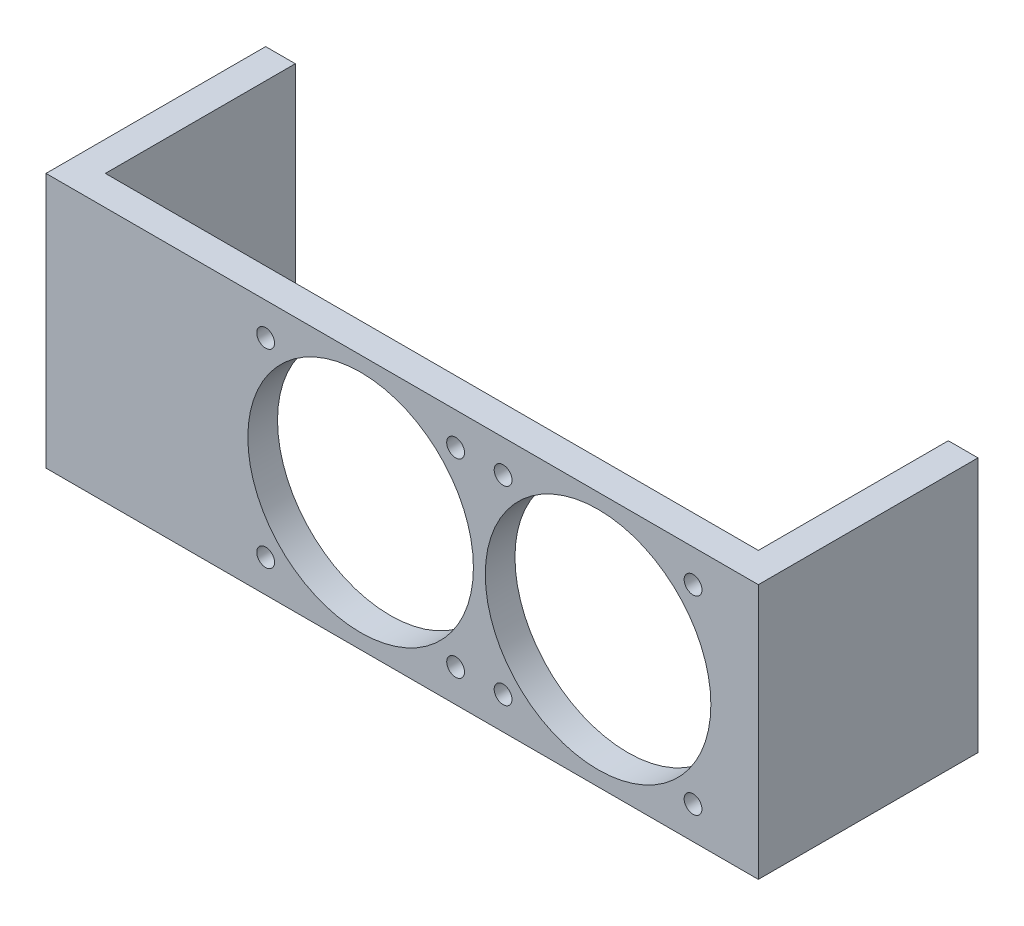
ISO-10303-21;
HEADER;
FILE_DESCRIPTION(('STEP AP214'),'2;1');
FILE_NAME('part.step','',(''),(''),'','','');
FILE_SCHEMA(('AUTOMOTIVE_DESIGN { 1 0 10303 214 1 1 1 1 }'));
ENDSEC;
DATA;
#1=APPLICATION_CONTEXT('core data for automotive mechanical design processes');
#2=APPLICATION_PROTOCOL_DEFINITION('international standard','automotive_design',2000,#1);
#3=PRODUCT_CONTEXT('',#1,'mechanical');
#4=PRODUCT('Part','Part','',(#3));
#5=PRODUCT_RELATED_PRODUCT_CATEGORY('part','',(#4));
#6=PRODUCT_DEFINITION_FORMATION('','',#4);
#7=PRODUCT_DEFINITION_CONTEXT('part definition',#1,'design');
#8=PRODUCT_DEFINITION('design','',#6,#7);
#9=PRODUCT_DEFINITION_SHAPE('','',#8);
#10=(LENGTH_UNIT() NAMED_UNIT(*) SI_UNIT(.MILLI.,.METRE.));
#11=(NAMED_UNIT(*) PLANE_ANGLE_UNIT() SI_UNIT($,.RADIAN.));
#12=(NAMED_UNIT(*) SI_UNIT($,.STERADIAN.) SOLID_ANGLE_UNIT());
#13=UNCERTAINTY_MEASURE_WITH_UNIT(LENGTH_MEASURE(1.E-05),#10,'distance_accuracy_value','');
#14=(GEOMETRIC_REPRESENTATION_CONTEXT(3) GLOBAL_UNCERTAINTY_ASSIGNED_CONTEXT((#13)) GLOBAL_UNIT_ASSIGNED_CONTEXT((#10,
#11,#12)) REPRESENTATION_CONTEXT('',''));
#15=CARTESIAN_POINT('',(0.,0.,0.));
#16=DIRECTION('',(0.,0.,1.));
#17=DIRECTION('',(1.,0.,0.));
#18=AXIS2_PLACEMENT_3D('',#15,#16,#17);
#19=CARTESIAN_POINT('',(0.,-17.2458628841607,5.));
#20=DIRECTION('',(0.,1.,0.));
#21=DIRECTION('',(0.,0.,1.));
#22=AXIS2_PLACEMENT_3D('',#19,#20,#21);
#23=PLANE('',#22);
#24=DIRECTION('',(1.,0.,0.));
#25=VECTOR('',#24,1.);
#26=CARTESIAN_POINT('',(0.,-17.2458628841607,0.));
#27=LINE('',#26,#25);
#28=CARTESIAN_POINT('',(-29.3853427895981,-17.2458628841608,0.));
#29=VERTEX_POINT('',#28);
#30=CARTESIAN_POINT('',(80.6146572104019,-17.2458628841607,0.));
#31=VERTEX_POINT('',#30);
#32=EDGE_CURVE('E196',#29,#31,#27,.T.);
#33=ORIENTED_EDGE('',*,*,#32,.T.);
#34=DIRECTION('',(0.,0.,1.));
#35=VECTOR('',#34,1.);
#36=CARTESIAN_POINT('',(80.6146572104019,-17.2458628841607,-32.));
#37=LINE('',#36,#35);
#38=CARTESIAN_POINT('',(80.6146572104019,-17.2458628841607,-32.));
#39=VERTEX_POINT('',#38);
#40=EDGE_CURVE('E60',#39,#31,#37,.T.);
#41=ORIENTED_EDGE('',*,*,#40,.F.);
#42=DIRECTION('',(1.,0.,0.));
#43=VECTOR('',#42,1.);
#44=CARTESIAN_POINT('',(80.6146572104019,-17.2458628841607,-32.));
#45=LINE('',#44,#43);
#46=CARTESIAN_POINT('',(85.6146572104019,-17.2458628841607,-32.));
#47=VERTEX_POINT('',#46);
#48=EDGE_CURVE('E143',#39,#47,#45,.T.);
#49=ORIENTED_EDGE('',*,*,#48,.T.);
#50=DIRECTION('',(0.,0.,1.));
#51=VECTOR('',#50,1.);
#52=CARTESIAN_POINT('',(85.6146572104019,-17.2458628841607,-32.));
#53=LINE('',#52,#51);
#54=CARTESIAN_POINT('',(85.6146572104019,-17.2458628841607,5.));
#55=VERTEX_POINT('',#54);
#56=EDGE_CURVE('E160',#47,#55,#53,.T.);
#57=ORIENTED_EDGE('',*,*,#56,.T.);
#58=DIRECTION('',(1.,0.,0.));
#59=VECTOR('',#58,1.);
#60=CARTESIAN_POINT('',(0.,-17.2458628841607,5.));
#61=LINE('',#60,#59);
#62=CARTESIAN_POINT('',(-34.3853427895981,-17.2458628841608,5.));
#63=VERTEX_POINT('',#62);
#64=EDGE_CURVE('E167',#63,#55,#61,.T.);
#65=ORIENTED_EDGE('',*,*,#64,.F.);
#66=DIRECTION('',(0.,0.,1.));
#67=VECTOR('',#66,1.);
#68=CARTESIAN_POINT('',(-34.3853427895981,-17.2458628841608,-32.));
#69=LINE('',#68,#67);
#70=CARTESIAN_POINT('',(-34.3853427895981,-17.2458628841608,-32.));
#71=VERTEX_POINT('',#70);
#72=EDGE_CURVE('E137',#71,#63,#69,.T.);
#73=ORIENTED_EDGE('',*,*,#72,.F.);
#74=DIRECTION('',(1.,0.,0.));
#75=VECTOR('',#74,1.);
#76=CARTESIAN_POINT('',(-29.3853427895981,-17.2458628841608,-32.));
#77=LINE('',#76,#75);
#78=CARTESIAN_POINT('',(-29.3853427895981,-17.2458628841608,-32.));
#79=VERTEX_POINT('',#78);
#80=EDGE_CURVE('E113',#71,#79,#77,.T.);
#81=ORIENTED_EDGE('',*,*,#80,.T.);
#82=DIRECTION('',(0.,0.,1.));
#83=VECTOR('',#82,1.);
#84=CARTESIAN_POINT('',(-29.3853427895981,-17.2458628841608,-32.));
#85=LINE('',#84,#83);
#86=EDGE_CURVE('E127',#79,#29,#85,.T.);
#87=ORIENTED_EDGE('',*,*,#86,.T.);
#88=EDGE_LOOP('',(#33,#41,#49,#57,#65,#73,#81,#87));
#89=FACE_BOUND('',#88,.T.);
#90=ADVANCED_FACE('F35',(#89),#23,.F.);
#91=CARTESIAN_POINT('',(0.,25.7541371158392,5.));
#92=DIRECTION('',(0.,1.,0.));
#93=DIRECTION('',(-1.,0.,0.));
#94=AXIS2_PLACEMENT_3D('',#91,#92,#93);
#95=PLANE('',#94);
#96=DIRECTION('',(1.,0.,0.));
#97=VECTOR('',#96,1.);
#98=CARTESIAN_POINT('',(0.,25.7541371158392,0.));
#99=LINE('',#98,#97);
#100=CARTESIAN_POINT('',(-29.3853427895981,25.7541371158392,0.));
#101=VERTEX_POINT('',#100);
#102=CARTESIAN_POINT('',(80.6146572104019,25.7541371158392,0.));
#103=VERTEX_POINT('',#102);
#104=EDGE_CURVE('E109',#101,#103,#99,.T.);
#105=ORIENTED_EDGE('',*,*,#104,.F.);
#106=DIRECTION('',(0.,0.,1.));
#107=VECTOR('',#106,1.);
#108=CARTESIAN_POINT('',(-29.3853427895981,25.7541371158392,-32.));
#109=LINE('',#108,#107);
#110=CARTESIAN_POINT('',(-29.3853427895981,25.7541371158392,-32.));
#111=VERTEX_POINT('',#110);
#112=EDGE_CURVE('E103',#111,#101,#109,.T.);
#113=ORIENTED_EDGE('',*,*,#112,.F.);
#114=DIRECTION('',(-1.,0.,0.));
#115=VECTOR('',#114,1.);
#116=CARTESIAN_POINT('',(-29.3853427895981,25.7541371158392,-32.));
#117=LINE('',#116,#115);
#118=CARTESIAN_POINT('',(-34.3853427895981,25.7541371158392,-32.));
#119=VERTEX_POINT('',#118);
#120=EDGE_CURVE('E107',#111,#119,#117,.T.);
#121=ORIENTED_EDGE('',*,*,#120,.T.);
#122=DIRECTION('',(0.,0.,1.));
#123=VECTOR('',#122,1.);
#124=CARTESIAN_POINT('',(-34.3853427895981,25.7541371158392,-32.));
#125=LINE('',#124,#123);
#126=CARTESIAN_POINT('',(-34.3853427895981,25.7541371158392,5.));
#127=VERTEX_POINT('',#126);
#128=EDGE_CURVE('E112',#119,#127,#125,.T.);
#129=ORIENTED_EDGE('',*,*,#128,.T.);
#130=DIRECTION('',(1.,0.,0.));
#131=VECTOR('',#130,1.);
#132=CARTESIAN_POINT('',(0.,25.7541371158392,5.));
#133=LINE('',#132,#131);
#134=CARTESIAN_POINT('',(85.6146572104019,25.7541371158393,5.));
#135=VERTEX_POINT('',#134);
#136=EDGE_CURVE('E169',#127,#135,#133,.T.);
#137=ORIENTED_EDGE('',*,*,#136,.T.);
#138=DIRECTION('',(0.,0.,1.));
#139=VECTOR('',#138,1.);
#140=CARTESIAN_POINT('',(85.6146572104019,25.7541371158393,-32.));
#141=LINE('',#140,#139);
#142=CARTESIAN_POINT('',(85.6146572104019,25.7541371158393,-32.));
#143=VERTEX_POINT('',#142);
#144=EDGE_CURVE('E157',#143,#135,#141,.T.);
#145=ORIENTED_EDGE('',*,*,#144,.F.);
#146=DIRECTION('',(-1.,0.,0.));
#147=VECTOR('',#146,1.);
#148=CARTESIAN_POINT('',(80.6146572104019,25.7541371158392,-32.));
#149=LINE('',#148,#147);
#150=CARTESIAN_POINT('',(80.6146572104019,25.7541371158392,-32.));
#151=VERTEX_POINT('',#150);
#152=EDGE_CURVE('E149',#143,#151,#149,.T.);
#153=ORIENTED_EDGE('',*,*,#152,.T.);
#154=DIRECTION('',(0.,0.,1.));
#155=VECTOR('',#154,1.);
#156=CARTESIAN_POINT('',(80.6146572104019,25.7541371158392,-32.));
#157=LINE('',#156,#155);
#158=EDGE_CURVE('E154',#151,#103,#157,.T.);
#159=ORIENTED_EDGE('',*,*,#158,.T.);
#160=EDGE_LOOP('',(#105,#113,#121,#129,#137,#145,#153,#159));
#161=FACE_BOUND('',#160,.T.);
#162=ADVANCED_FACE('F105',(#161),#95,.T.);
#163=CARTESIAN_POINT('',(74.6146572104018,20.2541371158392,5.));
#164=DIRECTION('',(0.,0.,-1.));
#165=DIRECTION('',(-1.,0.,0.));
#166=AXIS2_PLACEMENT_3D('',#163,#164,#165);
#167=CYLINDRICAL_SURFACE('',#166,1.5);
#168=CARTESIAN_POINT('',(74.6146572104018,20.2541371158392,5.));
#169=DIRECTION('',(0.,0.,1.));
#170=DIRECTION('',(1.,0.,0.));
#171=AXIS2_PLACEMENT_3D('',#168,#169,#170);
#172=CIRCLE('',#171,1.5);
#173=CARTESIAN_POINT('',(76.1146572104018,20.2541371158392,5.));
#174=VERTEX_POINT('',#173);
#175=EDGE_CURVE('E44',#174,#174,#172,.T.);
#176=ORIENTED_EDGE('',*,*,#175,.T.);
#177=EDGE_LOOP('',(#176));
#178=FACE_BOUND('',#177,.T.);
#179=CARTESIAN_POINT('',(74.6146572104018,20.2541371158392,0.));
#180=DIRECTION('',(0.,0.,1.));
#181=DIRECTION('',(1.,0.,0.));
#182=AXIS2_PLACEMENT_3D('',#179,#180,#181);
#183=CIRCLE('',#182,1.5);
#184=CARTESIAN_POINT('',(76.1146572104018,20.2541371158392,0.));
#185=VERTEX_POINT('',#184);
#186=EDGE_CURVE('E223',#185,#185,#183,.T.);
#187=ORIENTED_EDGE('',*,*,#186,.F.);
#188=EDGE_LOOP('',(#187));
#189=FACE_BOUND('',#188,.T.);
#190=ADVANCED_FACE('F253',(#178,#189),#167,.F.);
#191=CARTESIAN_POINT('',(42.6146572104019,-11.7458628841608,5.));
#192=DIRECTION('',(0.,0.,-1.));
#193=DIRECTION('',(-1.,0.,0.));
#194=AXIS2_PLACEMENT_3D('',#191,#192,#193);
#195=CYLINDRICAL_SURFACE('',#194,1.5);
#196=CARTESIAN_POINT('',(42.6146572104019,-11.7458628841608,5.));
#197=DIRECTION('',(0.,0.,1.));
#198=DIRECTION('',(1.,0.,0.));
#199=AXIS2_PLACEMENT_3D('',#196,#197,#198);
#200=CIRCLE('',#199,1.5);
#201=CARTESIAN_POINT('',(44.1146572104019,-11.7458628841608,5.));
#202=VERTEX_POINT('',#201);
#203=EDGE_CURVE('E189',#202,#202,#200,.F.);
#204=ORIENTED_EDGE('',*,*,#203,.F.);
#205=EDGE_LOOP('',(#204));
#206=FACE_BOUND('',#205,.T.);
#207=CARTESIAN_POINT('',(42.6146572104019,-11.7458628841608,0.));
#208=DIRECTION('',(0.,0.,1.));
#209=DIRECTION('',(1.,0.,0.));
#210=AXIS2_PLACEMENT_3D('',#207,#208,#209);
#211=CIRCLE('',#210,1.5);
#212=CARTESIAN_POINT('',(44.1146572104019,-11.7458628841608,0.));
#213=VERTEX_POINT('',#212);
#214=EDGE_CURVE('E221',#213,#213,#211,.F.);
#215=ORIENTED_EDGE('',*,*,#214,.T.);
#216=EDGE_LOOP('',(#215));
#217=FACE_BOUND('',#216,.T.);
#218=ADVANCED_FACE('F279',(#206,#217),#195,.F.);
#219=CARTESIAN_POINT('',(58.6146572104019,4.25413711583925,5.));
#220=DIRECTION('',(0.,0.,-1.));
#221=DIRECTION('',(-1.,0.,0.));
#222=AXIS2_PLACEMENT_3D('',#219,#220,#221);
#223=CYLINDRICAL_SURFACE('',#222,19.);
#224=CARTESIAN_POINT('',(58.6146572104019,4.25413711583925,5.));
#225=DIRECTION('',(0.,0.,1.));
#226=DIRECTION('',(1.,0.,0.));
#227=AXIS2_PLACEMENT_3D('',#224,#225,#226);
#228=CIRCLE('',#227,19.);
#229=CARTESIAN_POINT('',(77.6146572104019,4.25413711583925,5.));
#230=VERTEX_POINT('',#229);
#231=EDGE_CURVE('E186',#230,#230,#228,.T.);
#232=ORIENTED_EDGE('',*,*,#231,.T.);
#233=EDGE_LOOP('',(#232));
#234=FACE_BOUND('',#233,.T.);
#235=CARTESIAN_POINT('',(58.6146572104019,4.25413711583925,0.));
#236=DIRECTION('',(0.,0.,1.));
#237=DIRECTION('',(1.,0.,0.));
#238=AXIS2_PLACEMENT_3D('',#235,#236,#237);
#239=CIRCLE('',#238,19.);
#240=CARTESIAN_POINT('',(77.6146572104019,4.25413711583925,0.));
#241=VERTEX_POINT('',#240);
#242=EDGE_CURVE('E218',#241,#241,#239,.T.);
#243=ORIENTED_EDGE('',*,*,#242,.F.);
#244=EDGE_LOOP('',(#243));
#245=FACE_BOUND('',#244,.T.);
#246=ADVANCED_FACE('F275',(#234,#245),#223,.F.);
#247=CARTESIAN_POINT('',(74.6146572104019,-11.7458628841608,5.));
#248=DIRECTION('',(0.,0.,-1.));
#249=DIRECTION('',(-1.,0.,0.));
#250=AXIS2_PLACEMENT_3D('',#247,#248,#249);
#251=CYLINDRICAL_SURFACE('',#250,1.5);
#252=CARTESIAN_POINT('',(74.6146572104019,-11.7458628841608,5.));
#253=DIRECTION('',(0.,0.,1.));
#254=DIRECTION('',(1.,0.,0.));
#255=AXIS2_PLACEMENT_3D('',#252,#253,#254);
#256=CIRCLE('',#255,1.5);
#257=CARTESIAN_POINT('',(76.1146572104019,-11.7458628841608,5.));
#258=VERTEX_POINT('',#257);
#259=EDGE_CURVE('E183',#258,#258,#256,.T.);
#260=ORIENTED_EDGE('',*,*,#259,.T.);
#261=EDGE_LOOP('',(#260));
#262=FACE_BOUND('',#261,.T.);
#263=CARTESIAN_POINT('',(74.6146572104019,-11.7458628841608,0.));
#264=DIRECTION('',(0.,0.,1.));
#265=DIRECTION('',(1.,0.,0.));
#266=AXIS2_PLACEMENT_3D('',#263,#264,#265);
#267=CIRCLE('',#266,1.5);
#268=CARTESIAN_POINT('',(76.1146572104019,-11.7458628841608,0.));
#269=VERTEX_POINT('',#268);
#270=EDGE_CURVE('E215',#269,#269,#267,.T.);
#271=ORIENTED_EDGE('',*,*,#270,.F.);
#272=EDGE_LOOP('',(#271));
#273=FACE_BOUND('',#272,.T.);
#274=ADVANCED_FACE('F271',(#262,#273),#251,.F.);
#275=CARTESIAN_POINT('',(18.6146572104019,4.25413711583924,5.));
#276=DIRECTION('',(0.,0.,-1.));
#277=DIRECTION('',(-1.,0.,0.));
#278=AXIS2_PLACEMENT_3D('',#275,#276,#277);
#279=CYLINDRICAL_SURFACE('',#278,19.);
#280=CARTESIAN_POINT('',(18.6146572104019,4.25413711583924,5.));
#281=DIRECTION('',(0.,0.,1.));
#282=DIRECTION('',(1.,0.,0.));
#283=AXIS2_PLACEMENT_3D('',#280,#281,#282);
#284=CIRCLE('',#283,19.);
#285=CARTESIAN_POINT('',(37.6146572104019,4.25413711583924,5.));
#286=VERTEX_POINT('',#285);
#287=EDGE_CURVE('E180',#286,#286,#284,.F.);
#288=ORIENTED_EDGE('',*,*,#287,.F.);
#289=EDGE_LOOP('',(#288));
#290=FACE_BOUND('',#289,.T.);
#291=CARTESIAN_POINT('',(18.6146572104019,4.25413711583924,0.));
#292=DIRECTION('',(0.,0.,1.));
#293=DIRECTION('',(1.,0.,0.));
#294=AXIS2_PLACEMENT_3D('',#291,#292,#293);
#295=CIRCLE('',#294,19.);
#296=CARTESIAN_POINT('',(37.6146572104019,4.25413711583924,0.));
#297=VERTEX_POINT('',#296);
#298=EDGE_CURVE('E212',#297,#297,#295,.F.);
#299=ORIENTED_EDGE('',*,*,#298,.T.);
#300=EDGE_LOOP('',(#299));
#301=FACE_BOUND('',#300,.T.);
#302=ADVANCED_FACE('F267',(#290,#301),#279,.F.);
#303=CARTESIAN_POINT('',(34.6146572104019,20.2541371158392,5.));
#304=DIRECTION('',(0.,0.,-1.));
#305=DIRECTION('',(-1.,0.,0.));
#306=AXIS2_PLACEMENT_3D('',#303,#304,#305);
#307=CYLINDRICAL_SURFACE('',#306,1.5);
#308=CARTESIAN_POINT('',(34.6146572104019,20.2541371158392,5.));
#309=DIRECTION('',(0.,0.,1.));
#310=DIRECTION('',(1.,0.,0.));
#311=AXIS2_PLACEMENT_3D('',#308,#309,#310);
#312=CIRCLE('',#311,1.5);
#313=CARTESIAN_POINT('',(36.1146572104019,20.2541371158392,5.));
#314=VERTEX_POINT('',#313);
#315=EDGE_CURVE('E177',#314,#314,#312,.T.);
#316=ORIENTED_EDGE('',*,*,#315,.T.);
#317=EDGE_LOOP('',(#316));
#318=FACE_BOUND('',#317,.T.);
#319=CARTESIAN_POINT('',(34.6146572104019,20.2541371158392,0.));
#320=DIRECTION('',(0.,0.,1.));
#321=DIRECTION('',(1.,0.,0.));
#322=AXIS2_PLACEMENT_3D('',#319,#320,#321);
#323=CIRCLE('',#322,1.5);
#324=CARTESIAN_POINT('',(36.1146572104019,20.2541371158392,0.));
#325=VERTEX_POINT('',#324);
#326=EDGE_CURVE('E209',#325,#325,#323,.T.);
#327=ORIENTED_EDGE('',*,*,#326,.F.);
#328=EDGE_LOOP('',(#327));
#329=FACE_BOUND('',#328,.T.);
#330=ADVANCED_FACE('F263',(#318,#329),#307,.F.);
#331=CARTESIAN_POINT('',(2.61465721040187,-11.7458628841608,5.));
#332=DIRECTION('',(0.,0.,-1.));
#333=DIRECTION('',(-1.,0.,0.));
#334=AXIS2_PLACEMENT_3D('',#331,#332,#333);
#335=CYLINDRICAL_SURFACE('',#334,1.5);
#336=CARTESIAN_POINT('',(2.61465721040187,-11.7458628841608,5.));
#337=DIRECTION('',(0.,0.,1.));
#338=DIRECTION('',(1.,0.,0.));
#339=AXIS2_PLACEMENT_3D('',#336,#337,#338);
#340=CIRCLE('',#339,1.5);
#341=CARTESIAN_POINT('',(4.11465721040187,-11.7458628841608,5.));
#342=VERTEX_POINT('',#341);
#343=EDGE_CURVE('E174',#342,#342,#340,.F.);
#344=ORIENTED_EDGE('',*,*,#343,.F.);
#345=EDGE_LOOP('',(#344));
#346=FACE_BOUND('',#345,.T.);
#347=CARTESIAN_POINT('',(2.61465721040187,-11.7458628841608,0.));
#348=DIRECTION('',(0.,0.,1.));
#349=DIRECTION('',(1.,0.,0.));
#350=AXIS2_PLACEMENT_3D('',#347,#348,#349);
#351=CIRCLE('',#350,1.5);
#352=CARTESIAN_POINT('',(4.11465721040187,-11.7458628841608,0.));
#353=VERTEX_POINT('',#352);
#354=EDGE_CURVE('E206',#353,#353,#351,.F.);
#355=ORIENTED_EDGE('',*,*,#354,.T.);
#356=EDGE_LOOP('',(#355));
#357=FACE_BOUND('',#356,.T.);
#358=ADVANCED_FACE('F259',(#346,#357),#335,.F.);
#359=CARTESIAN_POINT('',(34.6146572104019,-11.7458628841608,5.));
#360=DIRECTION('',(0.,0.,-1.));
#361=DIRECTION('',(-1.,0.,0.));
#362=AXIS2_PLACEMENT_3D('',#359,#360,#361);
#363=CYLINDRICAL_SURFACE('',#362,1.5);
#364=CARTESIAN_POINT('',(34.6146572104019,-11.7458628841608,5.));
#365=DIRECTION('',(0.,0.,1.));
#366=DIRECTION('',(1.,0.,0.));
#367=AXIS2_PLACEMENT_3D('',#364,#365,#366);
#368=CIRCLE('',#367,1.5);
#369=CARTESIAN_POINT('',(36.1146572104019,-11.7458628841608,5.));
#370=VERTEX_POINT('',#369);
#371=EDGE_CURVE('E171',#370,#370,#368,.T.);
#372=ORIENTED_EDGE('',*,*,#371,.T.);
#373=EDGE_LOOP('',(#372));
#374=FACE_BOUND('',#373,.T.);
#375=CARTESIAN_POINT('',(34.6146572104019,-11.7458628841608,0.));
#376=DIRECTION('',(0.,0.,1.));
#377=DIRECTION('',(1.,0.,0.));
#378=AXIS2_PLACEMENT_3D('',#375,#376,#377);
#379=CIRCLE('',#378,1.5);
#380=CARTESIAN_POINT('',(36.1146572104019,-11.7458628841608,0.));
#381=VERTEX_POINT('',#380);
#382=EDGE_CURVE('E203',#381,#381,#379,.T.);
#383=ORIENTED_EDGE('',*,*,#382,.F.);
#384=EDGE_LOOP('',(#383));
#385=FACE_BOUND('',#384,.T.);
#386=ADVANCED_FACE('F256',(#374,#385),#363,.F.);
#387=CARTESIAN_POINT('',(2.61465721040187,20.2541371158392,5.));
#388=DIRECTION('',(0.,0.,-1.));
#389=DIRECTION('',(-1.,0.,0.));
#390=AXIS2_PLACEMENT_3D('',#387,#388,#389);
#391=CYLINDRICAL_SURFACE('',#390,1.5);
#392=CARTESIAN_POINT('',(2.61465721040187,20.2541371158392,5.));
#393=DIRECTION('',(0.,0.,1.));
#394=DIRECTION('',(1.,0.,0.));
#395=AXIS2_PLACEMENT_3D('',#392,#393,#394);
#396=CIRCLE('',#395,1.5);
#397=CARTESIAN_POINT('',(4.11465721040187,20.2541371158392,5.));
#398=VERTEX_POINT('',#397);
#399=EDGE_CURVE('E164',#398,#398,#396,.F.);
#400=ORIENTED_EDGE('',*,*,#399,.F.);
#401=EDGE_LOOP('',(#400));
#402=FACE_BOUND('',#401,.T.);
#403=CARTESIAN_POINT('',(2.61465721040187,20.2541371158392,0.));
#404=DIRECTION('',(0.,0.,1.));
#405=DIRECTION('',(1.,0.,0.));
#406=AXIS2_PLACEMENT_3D('',#403,#404,#405);
#407=CIRCLE('',#406,1.5);
#408=CARTESIAN_POINT('',(4.11465721040187,20.2541371158392,0.));
#409=VERTEX_POINT('',#408);
#410=EDGE_CURVE('E156',#409,#409,#407,.F.);
#411=ORIENTED_EDGE('',*,*,#410,.T.);
#412=EDGE_LOOP('',(#411));
#413=FACE_BOUND('',#412,.T.);
#414=ADVANCED_FACE('F37',(#402,#413),#391,.F.);
#415=CARTESIAN_POINT('',(42.6146572104019,20.2541371158392,5.));
#416=DIRECTION('',(0.,0.,-1.));
#417=DIRECTION('',(-1.,0.,0.));
#418=AXIS2_PLACEMENT_3D('',#415,#416,#417);
#419=CYLINDRICAL_SURFACE('',#418,1.5);
#420=CARTESIAN_POINT('',(42.6146572104019,20.2541371158392,5.));
#421=DIRECTION('',(0.,0.,1.));
#422=DIRECTION('',(1.,0.,0.));
#423=AXIS2_PLACEMENT_3D('',#420,#421,#422);
#424=CIRCLE('',#423,1.5);
#425=CARTESIAN_POINT('',(44.1146572104019,20.2541371158392,5.));
#426=VERTEX_POINT('',#425);
#427=EDGE_CURVE('E11',#426,#426,#424,.F.);
#428=ORIENTED_EDGE('',*,*,#427,.F.);
#429=EDGE_LOOP('',(#428));
#430=FACE_BOUND('',#429,.T.);
#431=CARTESIAN_POINT('',(42.6146572104019,20.2541371158392,0.));
#432=DIRECTION('',(0.,0.,1.));
#433=DIRECTION('',(1.,0.,0.));
#434=AXIS2_PLACEMENT_3D('',#431,#432,#433);
#435=CIRCLE('',#434,1.5);
#436=CARTESIAN_POINT('',(44.1146572104019,20.2541371158392,0.));
#437=VERTEX_POINT('',#436);
#438=EDGE_CURVE('E39',#437,#437,#435,.F.);
#439=ORIENTED_EDGE('',*,*,#438,.T.);
#440=EDGE_LOOP('',(#439));
#441=FACE_BOUND('',#440,.T.);
#442=ADVANCED_FACE('F230',(#430,#441),#419,.F.);
#443=CARTESIAN_POINT('',(0.,0.,5.));
#444=DIRECTION('',(0.,0.,1.));
#445=DIRECTION('',(1.,0.,0.));
#446=AXIS2_PLACEMENT_3D('',#443,#444,#445);
#447=PLANE('',#446);
#448=ORIENTED_EDGE('',*,*,#399,.T.);
#449=EDGE_LOOP('',(#448));
#450=FACE_BOUND('',#449,.T.);
#451=ORIENTED_EDGE('',*,*,#64,.T.);
#452=DIRECTION('',(0.,1.,0.));
#453=VECTOR('',#452,1.);
#454=CARTESIAN_POINT('',(85.6146572104019,25.7541371158393,5.));
#455=LINE('',#454,#453);
#456=EDGE_CURVE('E136',#55,#135,#455,.T.);
#457=ORIENTED_EDGE('',*,*,#456,.T.);
#458=ORIENTED_EDGE('',*,*,#136,.F.);
#459=DIRECTION('',(0.,-1.,0.));
#460=VECTOR('',#459,1.);
#461=CARTESIAN_POINT('',(-34.3853427895981,25.7541371158392,5.));
#462=LINE('',#461,#460);
#463=EDGE_CURVE('E128',#127,#63,#462,.T.);
#464=ORIENTED_EDGE('',*,*,#463,.T.);
#465=EDGE_LOOP('',(#451,#457,#458,#464));
#466=FACE_BOUND('',#465,.T.);
#467=ORIENTED_EDGE('',*,*,#371,.F.);
#468=EDGE_LOOP('',(#467));
#469=FACE_BOUND('',#468,.T.);
#470=ORIENTED_EDGE('',*,*,#343,.T.);
#471=EDGE_LOOP('',(#470));
#472=FACE_BOUND('',#471,.T.);
#473=ORIENTED_EDGE('',*,*,#315,.F.);
#474=EDGE_LOOP('',(#473));
#475=FACE_BOUND('',#474,.T.);
#476=ORIENTED_EDGE('',*,*,#287,.T.);
#477=EDGE_LOOP('',(#476));
#478=FACE_BOUND('',#477,.T.);
#479=ORIENTED_EDGE('',*,*,#259,.F.);
#480=EDGE_LOOP('',(#479));
#481=FACE_BOUND('',#480,.T.);
#482=ORIENTED_EDGE('',*,*,#231,.F.);
#483=EDGE_LOOP('',(#482));
#484=FACE_BOUND('',#483,.T.);
#485=ORIENTED_EDGE('',*,*,#203,.T.);
#486=EDGE_LOOP('',(#485));
#487=FACE_BOUND('',#486,.T.);
#488=ORIENTED_EDGE('',*,*,#175,.F.);
#489=EDGE_LOOP('',(#488));
#490=FACE_BOUND('',#489,.T.);
#491=ORIENTED_EDGE('',*,*,#427,.T.);
#492=EDGE_LOOP('',(#491));
#493=FACE_BOUND('',#492,.T.);
#494=ADVANCED_FACE('F235',(#450,#466,#469,#472,#475,#478,#481,#484,#487,#490,#493),#447,.T.);
#495=CARTESIAN_POINT('',(0.,0.,0.));
#496=DIRECTION('',(0.,0.,1.));
#497=DIRECTION('',(1.,0.,0.));
#498=AXIS2_PLACEMENT_3D('',#495,#496,#497);
#499=PLANE('',#498);
#500=ORIENTED_EDGE('',*,*,#410,.F.);
#501=EDGE_LOOP('',(#500));
#502=FACE_BOUND('',#501,.T.);
#503=ORIENTED_EDGE('',*,*,#32,.F.);
#504=DIRECTION('',(0.,-1.,0.));
#505=VECTOR('',#504,1.);
#506=CARTESIAN_POINT('',(-29.3853427895981,0.,0.));
#507=LINE('',#506,#505);
#508=EDGE_CURVE('E52',#101,#29,#507,.T.);
#509=ORIENTED_EDGE('',*,*,#508,.F.);
#510=ORIENTED_EDGE('',*,*,#104,.T.);
#511=DIRECTION('',(0.,-1.,0.));
#512=VECTOR('',#511,1.);
#513=CARTESIAN_POINT('',(80.6146572104019,0.,0.));
#514=LINE('',#513,#512);
#515=EDGE_CURVE('E198',#103,#31,#514,.T.);
#516=ORIENTED_EDGE('',*,*,#515,.T.);
#517=EDGE_LOOP('',(#503,#509,#510,#516));
#518=FACE_BOUND('',#517,.T.);
#519=ORIENTED_EDGE('',*,*,#382,.T.);
#520=EDGE_LOOP('',(#519));
#521=FACE_BOUND('',#520,.T.);
#522=ORIENTED_EDGE('',*,*,#354,.F.);
#523=EDGE_LOOP('',(#522));
#524=FACE_BOUND('',#523,.T.);
#525=ORIENTED_EDGE('',*,*,#326,.T.);
#526=EDGE_LOOP('',(#525));
#527=FACE_BOUND('',#526,.T.);
#528=ORIENTED_EDGE('',*,*,#298,.F.);
#529=EDGE_LOOP('',(#528));
#530=FACE_BOUND('',#529,.T.);
#531=ORIENTED_EDGE('',*,*,#270,.T.);
#532=EDGE_LOOP('',(#531));
#533=FACE_BOUND('',#532,.T.);
#534=ORIENTED_EDGE('',*,*,#242,.T.);
#535=EDGE_LOOP('',(#534));
#536=FACE_BOUND('',#535,.T.);
#537=ORIENTED_EDGE('',*,*,#214,.F.);
#538=EDGE_LOOP('',(#537));
#539=FACE_BOUND('',#538,.T.);
#540=ORIENTED_EDGE('',*,*,#186,.T.);
#541=EDGE_LOOP('',(#540));
#542=FACE_BOUND('',#541,.T.);
#543=ORIENTED_EDGE('',*,*,#438,.F.);
#544=EDGE_LOOP('',(#543));
#545=FACE_BOUND('',#544,.T.);
#546=ADVANCED_FACE('F232',(#502,#518,#521,#524,#527,#530,#533,#536,#539,#542,#545),#499,.F.);
#547=CARTESIAN_POINT('',(80.6146572104019,25.7541371158392,-32.));
#548=DIRECTION('',(-1.,0.,0.));
#549=DIRECTION('',(0.,0.,1.));
#550=AXIS2_PLACEMENT_3D('',#547,#548,#549);
#551=PLANE('',#550);
#552=ORIENTED_EDGE('',*,*,#515,.F.);
#553=ORIENTED_EDGE('',*,*,#158,.F.);
#554=DIRECTION('',(0.,-1.,0.));
#555=VECTOR('',#554,1.);
#556=CARTESIAN_POINT('',(80.6146572104019,25.7541371158392,-32.));
#557=LINE('',#556,#555);
#558=EDGE_CURVE('E141',#151,#39,#557,.T.);
#559=ORIENTED_EDGE('',*,*,#558,.T.);
#560=ORIENTED_EDGE('',*,*,#40,.T.);
#561=EDGE_LOOP('',(#552,#553,#559,#560));
#562=FACE_BOUND('',#561,.T.);
#563=ADVANCED_FACE('F234',(#562),#551,.T.);
#564=CARTESIAN_POINT('',(85.6146572104019,25.7541371158393,-32.));
#565=DIRECTION('',(1.,0.,0.));
#566=DIRECTION('',(0.,0.,-1.));
#567=AXIS2_PLACEMENT_3D('',#564,#565,#566);
#568=PLANE('',#567);
#569=ORIENTED_EDGE('',*,*,#456,.F.);
#570=ORIENTED_EDGE('',*,*,#56,.F.);
#571=DIRECTION('',(0.,1.,0.));
#572=VECTOR('',#571,1.);
#573=CARTESIAN_POINT('',(85.6146572104019,25.7541371158393,-32.));
#574=LINE('',#573,#572);
#575=EDGE_CURVE('E146',#47,#143,#574,.T.);
#576=ORIENTED_EDGE('',*,*,#575,.T.);
#577=ORIENTED_EDGE('',*,*,#144,.T.);
#578=EDGE_LOOP('',(#569,#570,#576,#577));
#579=FACE_BOUND('',#578,.T.);
#580=ADVANCED_FACE('F242',(#579),#568,.T.);
#581=CARTESIAN_POINT('',(0.,0.,-32.));
#582=DIRECTION('',(0.,0.,1.));
#583=DIRECTION('',(1.,0.,0.));
#584=AXIS2_PLACEMENT_3D('',#581,#582,#583);
#585=PLANE('',#584);
#586=ORIENTED_EDGE('',*,*,#558,.F.);
#587=ORIENTED_EDGE('',*,*,#152,.F.);
#588=ORIENTED_EDGE('',*,*,#575,.F.);
#589=ORIENTED_EDGE('',*,*,#48,.F.);
#590=EDGE_LOOP('',(#586,#587,#588,#589));
#591=FACE_BOUND('',#590,.T.);
#592=ADVANCED_FACE('F347',(#591),#585,.F.);
#593=CARTESIAN_POINT('',(-29.3853427895981,25.7541371158392,-32.));
#594=DIRECTION('',(1.,0.,0.));
#595=DIRECTION('',(0.,0.,-1.));
#596=AXIS2_PLACEMENT_3D('',#593,#594,#595);
#597=PLANE('',#596);
#598=ORIENTED_EDGE('',*,*,#112,.T.);
#599=ORIENTED_EDGE('',*,*,#508,.T.);
#600=ORIENTED_EDGE('',*,*,#86,.F.);
#601=DIRECTION('',(0.,1.,0.));
#602=VECTOR('',#601,1.);
#603=CARTESIAN_POINT('',(-29.3853427895981,25.7541371158392,-32.));
#604=LINE('',#603,#602);
#605=EDGE_CURVE('E120',#79,#111,#604,.T.);
#606=ORIENTED_EDGE('',*,*,#605,.T.);
#607=EDGE_LOOP('',(#598,#599,#600,#606));
#608=FACE_BOUND('',#607,.T.);
#609=ADVANCED_FACE('F125',(#608),#597,.T.);
#610=CARTESIAN_POINT('',(-34.3853427895981,25.7541371158392,-32.));
#611=DIRECTION('',(-1.,0.,0.));
#612=DIRECTION('',(0.,0.,1.));
#613=AXIS2_PLACEMENT_3D('',#610,#611,#612);
#614=PLANE('',#613);
#615=ORIENTED_EDGE('',*,*,#463,.F.);
#616=ORIENTED_EDGE('',*,*,#128,.F.);
#617=DIRECTION('',(0.,-1.,0.));
#618=VECTOR('',#617,1.);
#619=CARTESIAN_POINT('',(-34.3853427895981,25.7541371158392,-32.));
#620=LINE('',#619,#618);
#621=EDGE_CURVE('E123',#119,#71,#620,.T.);
#622=ORIENTED_EDGE('',*,*,#621,.T.);
#623=ORIENTED_EDGE('',*,*,#72,.T.);
#624=EDGE_LOOP('',(#615,#616,#622,#623));
#625=FACE_BOUND('',#624,.T.);
#626=ADVANCED_FACE('F344',(#625),#614,.T.);
#627=CARTESIAN_POINT('',(0.,0.,-32.));
#628=DIRECTION('',(0.,0.,-1.));
#629=DIRECTION('',(-1.,0.,0.));
#630=AXIS2_PLACEMENT_3D('',#627,#628,#629);
#631=PLANE('',#630);
#632=ORIENTED_EDGE('',*,*,#605,.F.);
#633=ORIENTED_EDGE('',*,*,#80,.F.);
#634=ORIENTED_EDGE('',*,*,#621,.F.);
#635=ORIENTED_EDGE('',*,*,#120,.F.);
#636=EDGE_LOOP('',(#632,#633,#634,#635));
#637=FACE_BOUND('',#636,.T.);
#638=ADVANCED_FACE('F118',(#637),#631,.T.);
#639=CLOSED_SHELL('',(#90,#162,#190,#218,#246,#274,#302,#330,#358,#386,#414,#442,#494,#546,#563,
#580,#592,#609,#626,#638));
#640=MANIFOLD_SOLID_BREP('B2',#639);
#641=ADVANCED_BREP_SHAPE_REPRESENTATION('',(#18,#640),#14);
#642=SHAPE_DEFINITION_REPRESENTATION(#9,#641);
ENDSEC;
END-ISO-10303-21;
